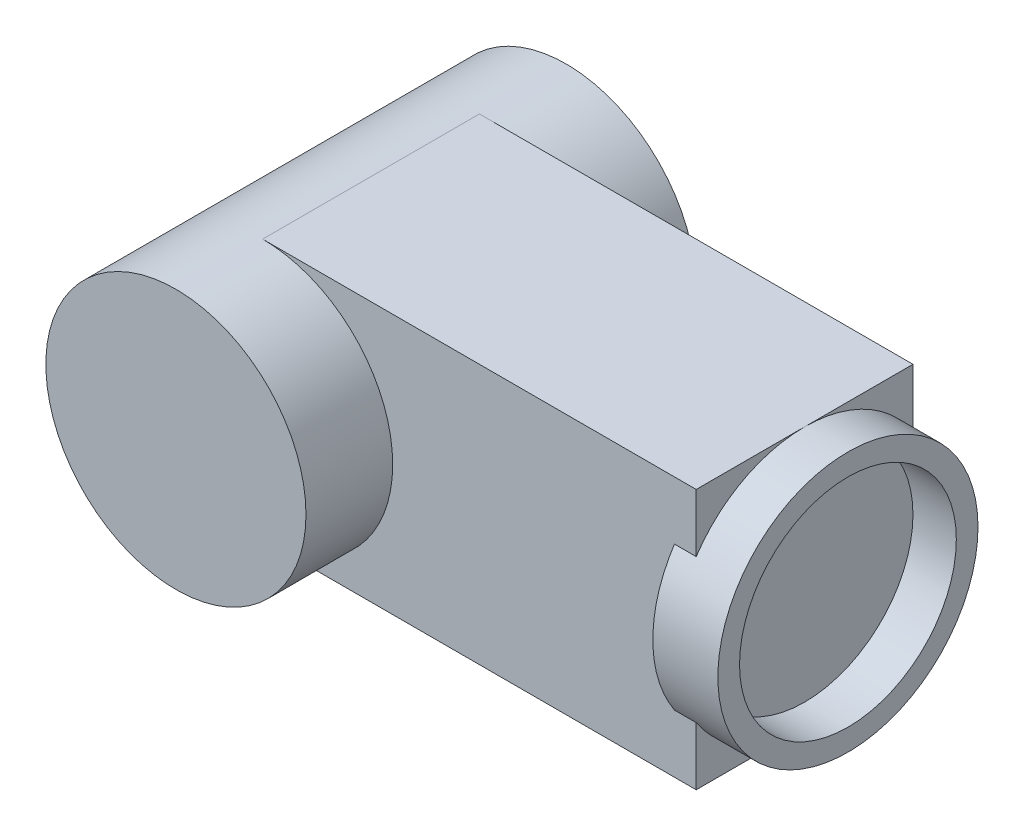
ISO-10303-21;
HEADER;
FILE_DESCRIPTION(('STEP AP214'),'2;1');
FILE_NAME('part.step','',(''),(''),'','','');
FILE_SCHEMA(('AUTOMOTIVE_DESIGN { 1 0 10303 214 1 1 1 1 }'));
ENDSEC;
DATA;
#1=APPLICATION_CONTEXT('core data for automotive mechanical design processes');
#2=APPLICATION_PROTOCOL_DEFINITION('international standard','automotive_design',2000,#1);
#3=PRODUCT_CONTEXT('',#1,'mechanical');
#4=PRODUCT('Part','Part','',(#3));
#5=PRODUCT_RELATED_PRODUCT_CATEGORY('part','',(#4));
#6=PRODUCT_DEFINITION_FORMATION('','',#4);
#7=PRODUCT_DEFINITION_CONTEXT('part definition',#1,'design');
#8=PRODUCT_DEFINITION('design','',#6,#7);
#9=PRODUCT_DEFINITION_SHAPE('','',#8);
#10=(LENGTH_UNIT() NAMED_UNIT(*) SI_UNIT(.MILLI.,.METRE.));
#11=(NAMED_UNIT(*) PLANE_ANGLE_UNIT() SI_UNIT($,.RADIAN.));
#12=(NAMED_UNIT(*) SI_UNIT($,.STERADIAN.) SOLID_ANGLE_UNIT());
#13=UNCERTAINTY_MEASURE_WITH_UNIT(LENGTH_MEASURE(1.E-05),#10,'distance_accuracy_value','');
#14=(GEOMETRIC_REPRESENTATION_CONTEXT(3) GLOBAL_UNCERTAINTY_ASSIGNED_CONTEXT((#13)) GLOBAL_UNIT_ASSIGNED_CONTEXT((#10,
#11,#12)) REPRESENTATION_CONTEXT('',''));
#15=CARTESIAN_POINT('',(0.,0.,0.));
#16=DIRECTION('',(0.,0.,1.));
#17=DIRECTION('',(1.,0.,0.));
#18=AXIS2_PLACEMENT_3D('',#15,#16,#17);
#19=CARTESIAN_POINT('',(50.,-30.,25.));
#20=DIRECTION('',(-1.,0.,0.));
#21=DIRECTION('',(0.,0.,1.));
#22=AXIS2_PLACEMENT_3D('',#19,#20,#21);
#23=PLANE('',#22);
#24=DIRECTION('',(0.,1.,0.));
#25=VECTOR('',#24,1.);
#26=CARTESIAN_POINT('',(50.,-30.,25.));
#27=LINE('',#26,#25);
#28=CARTESIAN_POINT('',(50.,16.583123951777,25.));
#29=VERTEX_POINT('',#28);
#30=CARTESIAN_POINT('',(50.,30.,25.));
#31=VERTEX_POINT('',#30);
#32=EDGE_CURVE('E106',#29,#31,#27,.T.);
#33=ORIENTED_EDGE('',*,*,#32,.F.);
#34=CARTESIAN_POINT('',(50.,0.,0.));
#35=DIRECTION('',(-1.,0.,0.));
#36=DIRECTION('',(0.,0.,1.));
#37=AXIS2_PLACEMENT_3D('',#34,#35,#36);
#38=CIRCLE('',#37,30.);
#39=CARTESIAN_POINT('',(50.,30.,0.));
#40=VERTEX_POINT('',#39);
#41=EDGE_CURVE('E186',#29,#40,#38,.T.);
#42=ORIENTED_EDGE('',*,*,#41,.T.);
#43=DIRECTION('',(0.,0.,-1.));
#44=VECTOR('',#43,1.);
#45=CARTESIAN_POINT('',(50.,30.,25.));
#46=LINE('',#45,#44);
#47=EDGE_CURVE('E126',#31,#40,#46,.T.);
#48=ORIENTED_EDGE('',*,*,#47,.F.);
#49=EDGE_LOOP('',(#33,#42,#48));
#50=FACE_BOUND('',#49,.T.);
#51=ADVANCED_FACE('F43',(#50),#23,.F.);
#52=CARTESIAN_POINT('',(50.,30.,-25.));
#53=VERTEX_POINT('',#52);
#54=EDGE_CURVE('E125',#40,#53,#46,.T.);
#55=ORIENTED_EDGE('',*,*,#54,.F.);
#56=CARTESIAN_POINT('',(50.,16.583123951777,-25.));
#57=VERTEX_POINT('',#56);
#58=EDGE_CURVE('E184',#40,#57,#38,.T.);
#59=ORIENTED_EDGE('',*,*,#58,.T.);
#60=DIRECTION('',(0.,1.,0.));
#61=VECTOR('',#60,1.);
#62=CARTESIAN_POINT('',(50.,-30.,-25.));
#63=LINE('',#62,#61);
#64=EDGE_CURVE('E113',#57,#53,#63,.T.);
#65=ORIENTED_EDGE('',*,*,#64,.T.);
#66=EDGE_LOOP('',(#55,#59,#65));
#67=FACE_BOUND('',#66,.T.);
#68=ADVANCED_FACE('F183',(#67),#23,.F.);
#69=CARTESIAN_POINT('',(50.,-30.,-25.));
#70=VERTEX_POINT('',#69);
#71=CARTESIAN_POINT('',(50.,-16.583123951777,-25.));
#72=VERTEX_POINT('',#71);
#73=EDGE_CURVE('E89',#70,#72,#63,.T.);
#74=ORIENTED_EDGE('',*,*,#73,.T.);
#75=CARTESIAN_POINT('',(50.,-30.,0.));
#76=VERTEX_POINT('',#75);
#77=EDGE_CURVE('E92',#72,#76,#38,.T.);
#78=ORIENTED_EDGE('',*,*,#77,.T.);
#79=DIRECTION('',(0.,0.,-1.));
#80=VECTOR('',#79,1.);
#81=CARTESIAN_POINT('',(50.,-30.,25.));
#82=LINE('',#81,#80);
#83=EDGE_CURVE('E84',#76,#70,#82,.T.);
#84=ORIENTED_EDGE('',*,*,#83,.T.);
#85=EDGE_LOOP('',(#74,#78,#84));
#86=FACE_BOUND('',#85,.T.);
#87=ADVANCED_FACE('F86',(#86),#23,.F.);
#88=CARTESIAN_POINT('',(50.,-30.,25.));
#89=VERTEX_POINT('',#88);
#90=EDGE_CURVE('E95',#89,#76,#82,.T.);
#91=ORIENTED_EDGE('',*,*,#90,.T.);
#92=CARTESIAN_POINT('',(50.,-16.583123951777,25.));
#93=VERTEX_POINT('',#92);
#94=EDGE_CURVE('E189',#76,#93,#38,.T.);
#95=ORIENTED_EDGE('',*,*,#94,.T.);
#96=EDGE_CURVE('E177',#89,#93,#27,.T.);
#97=ORIENTED_EDGE('',*,*,#96,.F.);
#98=EDGE_LOOP('',(#91,#95,#97));
#99=FACE_BOUND('',#98,.T.);
#100=ADVANCED_FACE('F45',(#99),#23,.F.);
#101=CARTESIAN_POINT('',(-50.,30.,25.));
#102=DIRECTION('',(0.,-1.,0.));
#103=DIRECTION('',(0.,0.,-1.));
#104=AXIS2_PLACEMENT_3D('',#101,#102,#103);
#105=PLANE('',#104);
#106=ORIENTED_EDGE('',*,*,#47,.T.);
#107=ORIENTED_EDGE('',*,*,#54,.T.);
#108=DIRECTION('',(-1.,0.,0.));
#109=VECTOR('',#108,1.);
#110=CARTESIAN_POINT('',(-50.,30.,-25.));
#111=LINE('',#110,#109);
#112=CARTESIAN_POINT('',(-50.,30.,-25.));
#113=VERTEX_POINT('',#112);
#114=EDGE_CURVE('E107',#53,#113,#111,.T.);
#115=ORIENTED_EDGE('',*,*,#114,.T.);
#116=DIRECTION('',(0.,0.,-1.));
#117=VECTOR('',#116,1.);
#118=CARTESIAN_POINT('',(-50.,30.,25.));
#119=LINE('',#118,#117);
#120=CARTESIAN_POINT('',(-50.,30.,25.));
#121=VERTEX_POINT('',#120);
#122=EDGE_CURVE('E123',#121,#113,#119,.T.);
#123=ORIENTED_EDGE('',*,*,#122,.F.);
#124=DIRECTION('',(-1.,0.,0.));
#125=VECTOR('',#124,1.);
#126=CARTESIAN_POINT('',(-50.,30.,25.));
#127=LINE('',#126,#125);
#128=EDGE_CURVE('E170',#31,#121,#127,.T.);
#129=ORIENTED_EDGE('',*,*,#128,.F.);
#130=EDGE_LOOP('',(#106,#107,#115,#123,#129));
#131=FACE_BOUND('',#130,.T.);
#132=ADVANCED_FACE('F178',(#131),#105,.F.);
#133=CARTESIAN_POINT('',(-50.,-30.,25.));
#134=DIRECTION('',(0.,1.,0.));
#135=DIRECTION('',(0.,0.,1.));
#136=AXIS2_PLACEMENT_3D('',#133,#134,#135);
#137=PLANE('',#136);
#138=ORIENTED_EDGE('',*,*,#83,.F.);
#139=ORIENTED_EDGE('',*,*,#90,.F.);
#140=DIRECTION('',(1.,0.,0.));
#141=VECTOR('',#140,1.);
#142=CARTESIAN_POINT('',(-50.,-30.,25.));
#143=LINE('',#142,#141);
#144=CARTESIAN_POINT('',(-50.,-30.,25.));
#145=VERTEX_POINT('',#144);
#146=EDGE_CURVE('E66',#145,#89,#143,.T.);
#147=ORIENTED_EDGE('',*,*,#146,.F.);
#148=DIRECTION('',(0.,0.,-1.));
#149=VECTOR('',#148,1.);
#150=CARTESIAN_POINT('',(-50.,-30.,25.));
#151=LINE('',#150,#149);
#152=CARTESIAN_POINT('',(-50.,-30.,-25.));
#153=VERTEX_POINT('',#152);
#154=EDGE_CURVE('E103',#145,#153,#151,.T.);
#155=ORIENTED_EDGE('',*,*,#154,.T.);
#156=DIRECTION('',(1.,0.,0.));
#157=VECTOR('',#156,1.);
#158=CARTESIAN_POINT('',(-50.,-30.,-25.));
#159=LINE('',#158,#157);
#160=EDGE_CURVE('E99',#153,#70,#159,.T.);
#161=ORIENTED_EDGE('',*,*,#160,.T.);
#162=EDGE_LOOP('',(#138,#139,#147,#155,#161));
#163=FACE_BOUND('',#162,.T.);
#164=ADVANCED_FACE('F100',(#163),#137,.F.);
#165=CARTESIAN_POINT('',(0.,0.,25.));
#166=DIRECTION('',(0.,0.,-1.));
#167=DIRECTION('',(-1.,0.,0.));
#168=AXIS2_PLACEMENT_3D('',#165,#166,#167);
#169=PLANE('',#168);
#170=DIRECTION('',(0.,-1.,0.));
#171=VECTOR('',#170,1.);
#172=CARTESIAN_POINT('',(45.,0.,25.));
#173=LINE('',#172,#171);
#174=CARTESIAN_POINT('',(45.,16.583123951777,25.));
#175=VERTEX_POINT('',#174);
#176=CARTESIAN_POINT('',(45.,-16.583123951777,25.));
#177=VERTEX_POINT('',#176);
#178=EDGE_CURVE('E190',#175,#177,#173,.T.);
#179=ORIENTED_EDGE('',*,*,#178,.F.);
#180=DIRECTION('',(1.,0.,0.));
#181=VECTOR('',#180,1.);
#182=CARTESIAN_POINT('',(45.,16.583123951777,25.));
#183=LINE('',#182,#181);
#184=EDGE_CURVE('E188',#175,#29,#183,.T.);
#185=ORIENTED_EDGE('',*,*,#184,.T.);
#186=ORIENTED_EDGE('',*,*,#32,.T.);
#187=ORIENTED_EDGE('',*,*,#128,.T.);
#188=CARTESIAN_POINT('',(-50.,0.,25.));
#189=DIRECTION('',(0.,0.,-1.));
#190=DIRECTION('',(-1.,0.,0.));
#191=AXIS2_PLACEMENT_3D('',#188,#189,#190);
#192=CIRCLE('',#191,30.);
#193=EDGE_CURVE('E118',#145,#121,#192,.F.);
#194=ORIENTED_EDGE('',*,*,#193,.F.);
#195=ORIENTED_EDGE('',*,*,#146,.T.);
#196=ORIENTED_EDGE('',*,*,#96,.T.);
#197=DIRECTION('',(1.,0.,0.));
#198=VECTOR('',#197,1.);
#199=CARTESIAN_POINT('',(45.,-16.583123951777,25.));
#200=LINE('',#199,#198);
#201=EDGE_CURVE('E195',#93,#177,#200,.F.);
#202=ORIENTED_EDGE('',*,*,#201,.T.);
#203=EDGE_LOOP('',(#179,#185,#186,#187,#194,#195,#196,#202));
#204=FACE_BOUND('',#203,.T.);
#205=ADVANCED_FACE('F172',(#204),#169,.F.);
#206=CARTESIAN_POINT('',(0.,0.,-25.));
#207=DIRECTION('',(0.,0.,-1.));
#208=DIRECTION('',(-1.,0.,0.));
#209=AXIS2_PLACEMENT_3D('',#206,#207,#208);
#210=PLANE('',#209);
#211=DIRECTION('',(1.,0.,0.));
#212=VECTOR('',#211,1.);
#213=CARTESIAN_POINT('',(45.,16.583123951777,-25.));
#214=LINE('',#213,#212);
#215=CARTESIAN_POINT('',(45.,16.583123951777,-25.));
#216=VERTEX_POINT('',#215);
#217=EDGE_CURVE('E11',#216,#57,#214,.T.);
#218=ORIENTED_EDGE('',*,*,#217,.F.);
#219=DIRECTION('',(0.,-1.,0.));
#220=VECTOR('',#219,1.);
#221=CARTESIAN_POINT('',(45.,0.,-25.));
#222=LINE('',#221,#220);
#223=CARTESIAN_POINT('',(45.,-16.583123951777,-25.));
#224=VERTEX_POINT('',#223);
#225=EDGE_CURVE('E131',#216,#224,#222,.T.);
#226=ORIENTED_EDGE('',*,*,#225,.T.);
#227=DIRECTION('',(1.,0.,0.));
#228=VECTOR('',#227,1.);
#229=CARTESIAN_POINT('',(45.,-16.583123951777,-25.));
#230=LINE('',#229,#228);
#231=EDGE_CURVE('E51',#72,#224,#230,.F.);
#232=ORIENTED_EDGE('',*,*,#231,.F.);
#233=ORIENTED_EDGE('',*,*,#73,.F.);
#234=ORIENTED_EDGE('',*,*,#160,.F.);
#235=CARTESIAN_POINT('',(-50.,0.,-25.));
#236=DIRECTION('',(0.,0.,-1.));
#237=DIRECTION('',(-1.,0.,0.));
#238=AXIS2_PLACEMENT_3D('',#235,#236,#237);
#239=CIRCLE('',#238,30.);
#240=EDGE_CURVE('E129',#153,#113,#239,.F.);
#241=ORIENTED_EDGE('',*,*,#240,.T.);
#242=ORIENTED_EDGE('',*,*,#114,.F.);
#243=ORIENTED_EDGE('',*,*,#64,.F.);
#244=EDGE_LOOP('',(#218,#226,#232,#233,#234,#241,#242,#243));
#245=FACE_BOUND('',#244,.T.);
#246=ADVANCED_FACE('F111',(#245),#210,.T.);
#247=CARTESIAN_POINT('',(-50.,0.,45.));
#248=DIRECTION('',(0.,0.,-1.));
#249=DIRECTION('',(-1.,0.,0.));
#250=AXIS2_PLACEMENT_3D('',#247,#248,#249);
#251=CYLINDRICAL_SURFACE('',#250,30.);
#252=CARTESIAN_POINT('',(-50.,0.,45.));
#253=DIRECTION('',(0.,0.,1.));
#254=DIRECTION('',(1.,0.,0.));
#255=AXIS2_PLACEMENT_3D('',#252,#253,#254);
#256=CIRCLE('',#255,30.);
#257=CARTESIAN_POINT('',(-20.,0.,45.));
#258=VERTEX_POINT('',#257);
#259=EDGE_CURVE('E167',#258,#258,#256,.T.);
#260=ORIENTED_EDGE('',*,*,#259,.F.);
#261=EDGE_LOOP('',(#260));
#262=FACE_BOUND('',#261,.T.);
#263=CARTESIAN_POINT('',(-50.,0.,-45.));
#264=DIRECTION('',(0.,0.,1.));
#265=DIRECTION('',(1.,0.,0.));
#266=AXIS2_PLACEMENT_3D('',#263,#264,#265);
#267=CIRCLE('',#266,30.);
#268=CARTESIAN_POINT('',(-20.,0.,-45.));
#269=VERTEX_POINT('',#268);
#270=EDGE_CURVE('E201',#269,#269,#267,.T.);
#271=ORIENTED_EDGE('',*,*,#270,.T.);
#272=EDGE_LOOP('',(#271));
#273=FACE_BOUND('',#272,.T.);
#274=ORIENTED_EDGE('',*,*,#154,.F.);
#275=ORIENTED_EDGE('',*,*,#193,.T.);
#276=ORIENTED_EDGE('',*,*,#122,.T.);
#277=ORIENTED_EDGE('',*,*,#240,.F.);
#278=EDGE_LOOP('',(#274,#275,#276,#277));
#279=FACE_BOUND('',#278,.T.);
#280=ADVANCED_FACE('F165',(#262,#273,#279),#251,.T.);
#281=CARTESIAN_POINT('',(-50.,0.,45.));
#282=DIRECTION('',(0.,0.,1.));
#283=DIRECTION('',(1.,0.,0.));
#284=AXIS2_PLACEMENT_3D('',#281,#282,#283);
#285=PLANE('',#284);
#286=ORIENTED_EDGE('',*,*,#259,.T.);
#287=EDGE_LOOP('',(#286));
#288=FACE_BOUND('',#287,.T.);
#289=ADVANCED_FACE('F374',(#288),#285,.T.);
#290=CARTESIAN_POINT('',(-50.,0.,-45.));
#291=DIRECTION('',(0.,0.,1.));
#292=DIRECTION('',(1.,0.,0.));
#293=AXIS2_PLACEMENT_3D('',#290,#291,#292);
#294=PLANE('',#293);
#295=ORIENTED_EDGE('',*,*,#270,.F.);
#296=EDGE_LOOP('',(#295));
#297=FACE_BOUND('',#296,.T.);
#298=ADVANCED_FACE('F239',(#297),#294,.F.);
#299=CARTESIAN_POINT('',(45.,0.,0.));
#300=DIRECTION('',(1.,0.,0.));
#301=DIRECTION('',(0.,0.,-1.));
#302=AXIS2_PLACEMENT_3D('',#299,#300,#301);
#303=CYLINDRICAL_SURFACE('',#302,25.);
#304=CARTESIAN_POINT('',(60.,0.,0.));
#305=DIRECTION('',(1.,0.,0.));
#306=DIRECTION('',(0.,0.,-1.));
#307=AXIS2_PLACEMENT_3D('',#304,#305,#306);
#308=CIRCLE('',#307,25.);
#309=CARTESIAN_POINT('',(60.,0.,-25.));
#310=VERTEX_POINT('',#309);
#311=EDGE_CURVE('E217',#310,#310,#308,.T.);
#312=ORIENTED_EDGE('',*,*,#311,.T.);
#313=EDGE_LOOP('',(#312));
#314=FACE_BOUND('',#313,.T.);
#315=CARTESIAN_POINT('',(50.,0.,0.));
#316=DIRECTION('',(-1.,0.,0.));
#317=DIRECTION('',(0.,0.,1.));
#318=AXIS2_PLACEMENT_3D('',#315,#316,#317);
#319=CIRCLE('',#318,25.);
#320=CARTESIAN_POINT('',(50.,0.,25.));
#321=VERTEX_POINT('',#320);
#322=EDGE_CURVE('E198',#321,#321,#319,.T.);
#323=ORIENTED_EDGE('',*,*,#322,.T.);
#324=EDGE_LOOP('',(#323));
#325=FACE_BOUND('',#324,.T.);
#326=ADVANCED_FACE('F221',(#314,#325),#303,.F.);
#327=CARTESIAN_POINT('',(45.,0.,0.));
#328=DIRECTION('',(1.,0.,0.));
#329=DIRECTION('',(0.,0.,-1.));
#330=AXIS2_PLACEMENT_3D('',#327,#328,#329);
#331=CYLINDRICAL_SURFACE('',#330,30.);
#332=CARTESIAN_POINT('',(60.,0.,0.));
#333=DIRECTION('',(1.,0.,0.));
#334=DIRECTION('',(0.,0.,-1.));
#335=AXIS2_PLACEMENT_3D('',#332,#333,#334);
#336=CIRCLE('',#335,30.);
#337=CARTESIAN_POINT('',(60.,0.,-30.));
#338=VERTEX_POINT('',#337);
#339=EDGE_CURVE('E213',#338,#338,#336,.T.);
#340=ORIENTED_EDGE('',*,*,#339,.F.);
#341=EDGE_LOOP('',(#340));
#342=FACE_BOUND('',#341,.T.);
#343=ORIENTED_EDGE('',*,*,#94,.F.);
#344=ORIENTED_EDGE('',*,*,#77,.F.);
#345=ORIENTED_EDGE('',*,*,#231,.T.);
#346=CARTESIAN_POINT('',(45.,0.,0.));
#347=DIRECTION('',(1.,0.,0.));
#348=DIRECTION('',(0.,0.,-1.));
#349=AXIS2_PLACEMENT_3D('',#346,#347,#348);
#350=CIRCLE('',#349,30.);
#351=EDGE_CURVE('E57',#224,#216,#350,.T.);
#352=ORIENTED_EDGE('',*,*,#351,.T.);
#353=ORIENTED_EDGE('',*,*,#217,.T.);
#354=ORIENTED_EDGE('',*,*,#58,.F.);
#355=ORIENTED_EDGE('',*,*,#41,.F.);
#356=ORIENTED_EDGE('',*,*,#184,.F.);
#357=EDGE_CURVE('E211',#175,#177,#350,.T.);
#358=ORIENTED_EDGE('',*,*,#357,.T.);
#359=ORIENTED_EDGE('',*,*,#201,.F.);
#360=EDGE_LOOP('',(#343,#344,#345,#352,#353,#354,#355,#356,#358,#359));
#361=FACE_BOUND('',#360,.T.);
#362=ADVANCED_FACE('F134',(#342,#361),#331,.T.);
#363=CARTESIAN_POINT('',(45.,0.,0.));
#364=DIRECTION('',(1.,0.,0.));
#365=DIRECTION('',(0.,0.,-1.));
#366=AXIS2_PLACEMENT_3D('',#363,#364,#365);
#367=PLANE('',#366);
#368=ORIENTED_EDGE('',*,*,#357,.F.);
#369=ORIENTED_EDGE('',*,*,#178,.T.);
#370=EDGE_LOOP('',(#368,#369));
#371=FACE_BOUND('',#370,.T.);
#372=ADVANCED_FACE('F232',(#371),#367,.F.);
#373=ORIENTED_EDGE('',*,*,#225,.F.);
#374=ORIENTED_EDGE('',*,*,#351,.F.);
#375=EDGE_LOOP('',(#373,#374));
#376=FACE_BOUND('',#375,.T.);
#377=ADVANCED_FACE('F137',(#376),#367,.F.);
#378=CARTESIAN_POINT('',(60.,0.,0.));
#379=DIRECTION('',(1.,0.,0.));
#380=DIRECTION('',(0.,0.,-1.));
#381=AXIS2_PLACEMENT_3D('',#378,#379,#380);
#382=PLANE('',#381);
#383=ORIENTED_EDGE('',*,*,#311,.F.);
#384=EDGE_LOOP('',(#383));
#385=FACE_BOUND('',#384,.T.);
#386=ORIENTED_EDGE('',*,*,#339,.T.);
#387=EDGE_LOOP('',(#386));
#388=FACE_BOUND('',#387,.T.);
#389=ADVANCED_FACE('F224',(#385,#388),#382,.T.);
#390=ORIENTED_EDGE('',*,*,#322,.F.);
#391=EDGE_LOOP('',(#390));
#392=FACE_BOUND('',#391,.T.);
#393=ADVANCED_FACE('F227',(#392),#23,.F.);
#394=CLOSED_SHELL('',(#51,#68,#87,#100,#132,#164,#205,#246,#280,#289,#298,#326,#362,#372,#377,
#389,#393));
#395=MANIFOLD_SOLID_BREP('B2',#394);
#396=ADVANCED_BREP_SHAPE_REPRESENTATION('',(#18,#395),#14);
#397=SHAPE_DEFINITION_REPRESENTATION(#9,#396);
ENDSEC;
END-ISO-10303-21;
